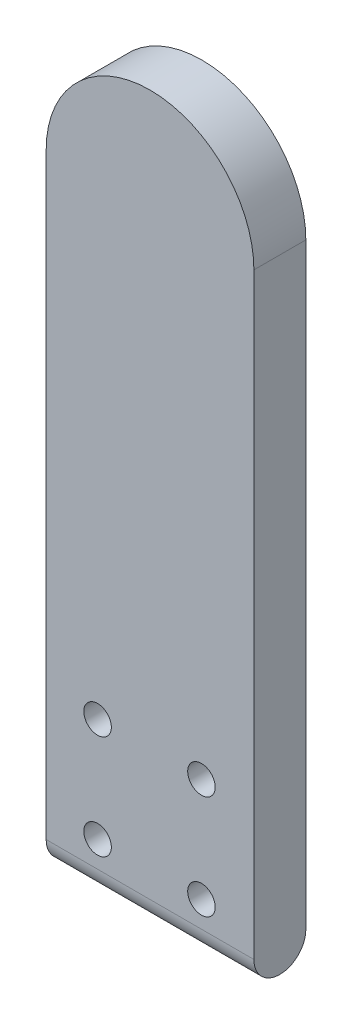
ISO-10303-21;
HEADER;
FILE_DESCRIPTION(('STEP AP214'),'2;1');
FILE_NAME('part.step','',(''),(''),'','','');
FILE_SCHEMA(('AUTOMOTIVE_DESIGN { 1 0 10303 214 1 1 1 1 }'));
ENDSEC;
DATA;
#1=APPLICATION_CONTEXT('core data for automotive mechanical design processes');
#2=APPLICATION_PROTOCOL_DEFINITION('international standard','automotive_design',2000,#1);
#3=PRODUCT_CONTEXT('',#1,'mechanical');
#4=PRODUCT('Part','Part','',(#3));
#5=PRODUCT_RELATED_PRODUCT_CATEGORY('part','',(#4));
#6=PRODUCT_DEFINITION_FORMATION('','',#4);
#7=PRODUCT_DEFINITION_CONTEXT('part definition',#1,'design');
#8=PRODUCT_DEFINITION('design','',#6,#7);
#9=PRODUCT_DEFINITION_SHAPE('','',#8);
#10=(LENGTH_UNIT() NAMED_UNIT(*) SI_UNIT(.MILLI.,.METRE.));
#11=(NAMED_UNIT(*) PLANE_ANGLE_UNIT() SI_UNIT($,.RADIAN.));
#12=(NAMED_UNIT(*) SI_UNIT($,.STERADIAN.) SOLID_ANGLE_UNIT());
#13=UNCERTAINTY_MEASURE_WITH_UNIT(LENGTH_MEASURE(1.E-05),#10,'distance_accuracy_value','');
#14=(GEOMETRIC_REPRESENTATION_CONTEXT(3) GLOBAL_UNCERTAINTY_ASSIGNED_CONTEXT((#13)) GLOBAL_UNIT_ASSIGNED_CONTEXT((#10,
#11,#12)) REPRESENTATION_CONTEXT('',''));
#15=CARTESIAN_POINT('',(0.,0.,0.));
#16=DIRECTION('',(0.,0.,1.));
#17=DIRECTION('',(1.,0.,0.));
#18=AXIS2_PLACEMENT_3D('',#15,#16,#17);
#19=CARTESIAN_POINT('',(-15.2585866419371,120.,6.19989115980894));
#20=DIRECTION('',(0.,0.,-1.));
#21=DIRECTION('',(-1.,0.,0.));
#22=AXIS2_PLACEMENT_3D('',#19,#20,#21);
#23=CYLINDRICAL_SURFACE('',#22,20.);
#24=DIRECTION('',(0.,0.,1.));
#25=VECTOR('',#24,1.);
#26=CARTESIAN_POINT('',(4.74141335806288,120.,6.19989115980894));
#27=LINE('',#26,#25);
#28=CARTESIAN_POINT('',(4.74141335806288,120.,6.19989115980894));
#29=VERTEX_POINT('',#28);
#30=CARTESIAN_POINT('',(4.74141335806288,120.,16.1998911598089));
#31=VERTEX_POINT('',#30);
#32=EDGE_CURVE('E105',#29,#31,#27,.T.);
#33=ORIENTED_EDGE('',*,*,#32,.F.);
#34=CARTESIAN_POINT('',(-15.2585866419371,120.,6.19989115980894));
#35=DIRECTION('',(0.,0.,1.));
#36=DIRECTION('',(1.,0.,0.));
#37=AXIS2_PLACEMENT_3D('',#34,#35,#36);
#38=CIRCLE('',#37,20.);
#39=CARTESIAN_POINT('',(-35.2585866419371,120.,6.19989115980894));
#40=VERTEX_POINT('',#39);
#41=EDGE_CURVE('E91',#40,#29,#38,.F.);
#42=ORIENTED_EDGE('',*,*,#41,.F.);
#43=DIRECTION('',(0.,0.,1.));
#44=VECTOR('',#43,1.);
#45=CARTESIAN_POINT('',(-35.2585866419371,120.,6.19989115980894));
#46=LINE('',#45,#44);
#47=CARTESIAN_POINT('',(-35.2585866419371,120.,16.1998911598089));
#48=VERTEX_POINT('',#47);
#49=EDGE_CURVE('E102',#48,#40,#46,.F.);
#50=ORIENTED_EDGE('',*,*,#49,.F.);
#51=CARTESIAN_POINT('',(-15.2585866419371,120.,16.1998911598089));
#52=DIRECTION('',(0.,0.,-1.));
#53=DIRECTION('',(-1.,0.,0.));
#54=AXIS2_PLACEMENT_3D('',#51,#52,#53);
#55=CIRCLE('',#54,20.);
#56=EDGE_CURVE('E101',#31,#48,#55,.F.);
#57=ORIENTED_EDGE('',*,*,#56,.F.);
#58=EDGE_LOOP('',(#33,#42,#50,#57));
#59=FACE_BOUND('',#58,.T.);
#60=ADVANCED_FACE('F45',(#59),#23,.T.);
#61=CARTESIAN_POINT('',(-35.2585866419371,140.,6.19989115980894));
#62=DIRECTION('',(1.,0.,0.));
#63=DIRECTION('',(0.,0.,-1.));
#64=AXIS2_PLACEMENT_3D('',#61,#62,#63);
#65=PLANE('',#64);
#66=CARTESIAN_POINT('',(-35.2585866419371,5.,11.1998911598089));
#67=DIRECTION('',(1.,0.,0.));
#68=DIRECTION('',(0.,0.,-1.));
#69=AXIS2_PLACEMENT_3D('',#66,#67,#68);
#70=CIRCLE('',#69,5.);
#71=CARTESIAN_POINT('',(-35.2585866419371,5.,6.19989115980894));
#72=VERTEX_POINT('',#71);
#73=CARTESIAN_POINT('',(-35.2585866419371,0.,11.1998911598089));
#74=VERTEX_POINT('',#73);
#75=EDGE_CURVE('E62',#72,#74,#70,.F.);
#76=ORIENTED_EDGE('',*,*,#75,.T.);
#77=CARTESIAN_POINT('',(-35.2585866419371,5.,11.1998911598089));
#78=DIRECTION('',(1.,0.,0.));
#79=DIRECTION('',(0.,0.,-1.));
#80=AXIS2_PLACEMENT_3D('',#77,#78,#79);
#81=CIRCLE('',#80,5.);
#82=CARTESIAN_POINT('',(-35.2585866419371,5.,16.1998911598089));
#83=VERTEX_POINT('',#82);
#84=EDGE_CURVE('E55',#74,#83,#81,.F.);
#85=ORIENTED_EDGE('',*,*,#84,.T.);
#86=DIRECTION('',(0.,-1.,0.));
#87=VECTOR('',#86,1.);
#88=CARTESIAN_POINT('',(-35.2585866419371,140.,16.1998911598089));
#89=LINE('',#88,#87);
#90=EDGE_CURVE('E110',#48,#83,#89,.T.);
#91=ORIENTED_EDGE('',*,*,#90,.F.);
#92=ORIENTED_EDGE('',*,*,#49,.T.);
#93=DIRECTION('',(0.,-1.,0.));
#94=VECTOR('',#93,1.);
#95=CARTESIAN_POINT('',(-35.2585866419371,140.,6.19989115980894));
#96=LINE('',#95,#94);
#97=EDGE_CURVE('E96',#40,#72,#96,.T.);
#98=ORIENTED_EDGE('',*,*,#97,.T.);
#99=EDGE_LOOP('',(#76,#85,#91,#92,#98));
#100=FACE_BOUND('',#99,.T.);
#101=ADVANCED_FACE('F146',(#100),#65,.F.);
#102=CARTESIAN_POINT('',(-35.2585866419371,140.,16.1998911598089));
#103=DIRECTION('',(0.,0.,-1.));
#104=DIRECTION('',(-1.,0.,0.));
#105=AXIS2_PLACEMENT_3D('',#102,#103,#104);
#106=PLANE('',#105);
#107=CARTESIAN_POINT('',(-5.35858664193712,30.,16.1998911598089));
#108=DIRECTION('',(0.,0.,-1.));
#109=DIRECTION('',(-1.,0.,0.));
#110=AXIS2_PLACEMENT_3D('',#107,#108,#109);
#111=CIRCLE('',#110,2.65);
#112=CARTESIAN_POINT('',(-8.00858664193711,30.,16.1998911598089));
#113=VERTEX_POINT('',#112);
#114=EDGE_CURVE('E155',#113,#113,#111,.T.);
#115=ORIENTED_EDGE('',*,*,#114,.T.);
#116=EDGE_LOOP('',(#115));
#117=FACE_BOUND('',#116,.T.);
#118=CARTESIAN_POINT('',(-25.3585866419371,30.,16.1998911598089));
#119=DIRECTION('',(0.,0.,-1.));
#120=DIRECTION('',(-1.,0.,0.));
#121=AXIS2_PLACEMENT_3D('',#118,#119,#120);
#122=CIRCLE('',#121,2.65);
#123=CARTESIAN_POINT('',(-28.0085866419371,30.,16.1998911598089));
#124=VERTEX_POINT('',#123);
#125=EDGE_CURVE('E164',#124,#124,#122,.T.);
#126=ORIENTED_EDGE('',*,*,#125,.T.);
#127=EDGE_LOOP('',(#126));
#128=FACE_BOUND('',#127,.T.);
#129=CARTESIAN_POINT('',(-25.3585866419371,10.,16.1998911598089));
#130=DIRECTION('',(0.,0.,-1.));
#131=DIRECTION('',(-1.,0.,0.));
#132=AXIS2_PLACEMENT_3D('',#129,#130,#131);
#133=CIRCLE('',#132,2.65);
#134=CARTESIAN_POINT('',(-28.0085866419371,10.,16.1998911598089));
#135=VERTEX_POINT('',#134);
#136=EDGE_CURVE('E178',#135,#135,#133,.T.);
#137=ORIENTED_EDGE('',*,*,#136,.T.);
#138=EDGE_LOOP('',(#137));
#139=FACE_BOUND('',#138,.T.);
#140=CARTESIAN_POINT('',(-5.35858664193711,10.,16.1998911598089));
#141=DIRECTION('',(0.,0.,-1.));
#142=DIRECTION('',(-1.,0.,0.));
#143=AXIS2_PLACEMENT_3D('',#140,#141,#142);
#144=CIRCLE('',#143,2.65);
#145=CARTESIAN_POINT('',(-8.00858664193711,10.,16.1998911598089));
#146=VERTEX_POINT('',#145);
#147=EDGE_CURVE('E121',#146,#146,#144,.T.);
#148=ORIENTED_EDGE('',*,*,#147,.T.);
#149=EDGE_LOOP('',(#148));
#150=FACE_BOUND('',#149,.T.);
#151=ORIENTED_EDGE('',*,*,#90,.T.);
#152=DIRECTION('',(1.,0.,0.));
#153=VECTOR('',#152,1.);
#154=CARTESIAN_POINT('',(-35.2585866419371,5.,16.1998911598089));
#155=LINE('',#154,#153);
#156=CARTESIAN_POINT('',(4.74141335806288,5.,16.1998911598089));
#157=VERTEX_POINT('',#156);
#158=EDGE_CURVE('E132',#83,#157,#155,.T.);
#159=ORIENTED_EDGE('',*,*,#158,.T.);
#160=DIRECTION('',(0.,-1.,0.));
#161=VECTOR('',#160,1.);
#162=CARTESIAN_POINT('',(4.74141335806288,140.,16.1998911598089));
#163=LINE('',#162,#161);
#164=EDGE_CURVE('E116',#31,#157,#163,.T.);
#165=ORIENTED_EDGE('',*,*,#164,.F.);
#166=ORIENTED_EDGE('',*,*,#56,.T.);
#167=EDGE_LOOP('',(#151,#159,#165,#166));
#168=FACE_BOUND('',#167,.T.);
#169=ADVANCED_FACE('F151',(#117,#128,#139,#150,#168),#106,.F.);
#170=CARTESIAN_POINT('',(4.74141335806288,140.,6.19989115980894));
#171=DIRECTION('',(-1.,0.,0.));
#172=DIRECTION('',(0.,0.,1.));
#173=AXIS2_PLACEMENT_3D('',#170,#171,#172);
#174=PLANE('',#173);
#175=ORIENTED_EDGE('',*,*,#164,.T.);
#176=CARTESIAN_POINT('',(4.74141335806288,5.,11.1998911598089));
#177=DIRECTION('',(-1.,0.,0.));
#178=DIRECTION('',(0.,0.,1.));
#179=AXIS2_PLACEMENT_3D('',#176,#177,#178);
#180=CIRCLE('',#179,5.);
#181=CARTESIAN_POINT('',(4.74141335806288,0.,11.1998911598089));
#182=VERTEX_POINT('',#181);
#183=EDGE_CURVE('E138',#157,#182,#180,.F.);
#184=ORIENTED_EDGE('',*,*,#183,.T.);
#185=CARTESIAN_POINT('',(4.74141335806288,5.,11.1998911598089));
#186=DIRECTION('',(-1.,0.,0.));
#187=DIRECTION('',(0.,0.,1.));
#188=AXIS2_PLACEMENT_3D('',#185,#186,#187);
#189=CIRCLE('',#188,5.);
#190=CARTESIAN_POINT('',(4.74141335806288,5.,6.19989115980894));
#191=VERTEX_POINT('',#190);
#192=EDGE_CURVE('E114',#182,#191,#189,.F.);
#193=ORIENTED_EDGE('',*,*,#192,.T.);
#194=DIRECTION('',(0.,-1.,0.));
#195=VECTOR('',#194,1.);
#196=CARTESIAN_POINT('',(4.74141335806288,140.,6.19989115980894));
#197=LINE('',#196,#195);
#198=EDGE_CURVE('E95',#29,#191,#197,.T.);
#199=ORIENTED_EDGE('',*,*,#198,.F.);
#200=ORIENTED_EDGE('',*,*,#32,.T.);
#201=EDGE_LOOP('',(#175,#184,#193,#199,#200));
#202=FACE_BOUND('',#201,.T.);
#203=ADVANCED_FACE('F112',(#202),#174,.F.);
#204=CARTESIAN_POINT('',(-35.2585866419371,140.,6.19989115980894));
#205=DIRECTION('',(0.,0.,1.));
#206=DIRECTION('',(1.,0.,0.));
#207=AXIS2_PLACEMENT_3D('',#204,#205,#206);
#208=PLANE('',#207);
#209=CARTESIAN_POINT('',(-5.35858664193712,30.,6.19989115980894));
#210=DIRECTION('',(0.,0.,-1.));
#211=DIRECTION('',(-1.,0.,0.));
#212=AXIS2_PLACEMENT_3D('',#209,#210,#211);
#213=CIRCLE('',#212,2.65);
#214=CARTESIAN_POINT('',(-8.00858664193711,30.,6.19989115980894));
#215=VERTEX_POINT('',#214);
#216=EDGE_CURVE('E158',#215,#215,#213,.T.);
#217=ORIENTED_EDGE('',*,*,#216,.F.);
#218=EDGE_LOOP('',(#217));
#219=FACE_BOUND('',#218,.T.);
#220=CARTESIAN_POINT('',(-25.3585866419371,30.,6.19989115980894));
#221=DIRECTION('',(0.,0.,-1.));
#222=DIRECTION('',(-1.,0.,0.));
#223=AXIS2_PLACEMENT_3D('',#220,#221,#222);
#224=CIRCLE('',#223,2.65);
#225=CARTESIAN_POINT('',(-28.0085866419371,30.,6.19989115980894));
#226=VERTEX_POINT('',#225);
#227=EDGE_CURVE('E184',#226,#226,#224,.T.);
#228=ORIENTED_EDGE('',*,*,#227,.F.);
#229=EDGE_LOOP('',(#228));
#230=FACE_BOUND('',#229,.T.);
#231=CARTESIAN_POINT('',(-25.3585866419371,10.,6.19989115980894));
#232=DIRECTION('',(0.,0.,-1.));
#233=DIRECTION('',(-1.,0.,0.));
#234=AXIS2_PLACEMENT_3D('',#231,#232,#233);
#235=CIRCLE('',#234,2.65);
#236=CARTESIAN_POINT('',(-28.0085866419371,10.,6.19989115980894));
#237=VERTEX_POINT('',#236);
#238=EDGE_CURVE('E173',#237,#237,#235,.T.);
#239=ORIENTED_EDGE('',*,*,#238,.F.);
#240=EDGE_LOOP('',(#239));
#241=FACE_BOUND('',#240,.T.);
#242=CARTESIAN_POINT('',(-5.35858664193711,10.,6.19989115980894));
#243=DIRECTION('',(0.,0.,-1.));
#244=DIRECTION('',(-1.,0.,0.));
#245=AXIS2_PLACEMENT_3D('',#242,#243,#244);
#246=CIRCLE('',#245,2.65);
#247=CARTESIAN_POINT('',(-8.00858664193711,10.,6.19989115980894));
#248=VERTEX_POINT('',#247);
#249=EDGE_CURVE('E170',#248,#248,#246,.T.);
#250=ORIENTED_EDGE('',*,*,#249,.F.);
#251=EDGE_LOOP('',(#250));
#252=FACE_BOUND('',#251,.T.);
#253=ORIENTED_EDGE('',*,*,#198,.T.);
#254=DIRECTION('',(-1.,0.,0.));
#255=VECTOR('',#254,1.);
#256=CARTESIAN_POINT('',(-35.2585866419371,5.,6.19989115980894));
#257=LINE('',#256,#255);
#258=EDGE_CURVE('E11',#191,#72,#257,.T.);
#259=ORIENTED_EDGE('',*,*,#258,.T.);
#260=ORIENTED_EDGE('',*,*,#97,.F.);
#261=ORIENTED_EDGE('',*,*,#41,.T.);
#262=EDGE_LOOP('',(#253,#259,#260,#261));
#263=FACE_BOUND('',#262,.T.);
#264=ADVANCED_FACE('F93',(#219,#230,#241,#252,#263),#208,.F.);
#265=CARTESIAN_POINT('',(-5.35858664193711,10.,16.1998911598089));
#266=DIRECTION('',(0.,0.,-1.));
#267=DIRECTION('',(-1.,0.,0.));
#268=AXIS2_PLACEMENT_3D('',#265,#266,#267);
#269=CYLINDRICAL_SURFACE('',#268,2.65);
#270=ORIENTED_EDGE('',*,*,#147,.F.);
#271=EDGE_LOOP('',(#270));
#272=FACE_BOUND('',#271,.T.);
#273=ORIENTED_EDGE('',*,*,#249,.T.);
#274=EDGE_LOOP('',(#273));
#275=FACE_BOUND('',#274,.T.);
#276=ADVANCED_FACE('F205',(#272,#275),#269,.F.);
#277=CARTESIAN_POINT('',(-25.3585866419371,10.,16.1998911598089));
#278=DIRECTION('',(0.,0.,-1.));
#279=DIRECTION('',(-1.,0.,0.));
#280=AXIS2_PLACEMENT_3D('',#277,#278,#279);
#281=CYLINDRICAL_SURFACE('',#280,2.65);
#282=ORIENTED_EDGE('',*,*,#136,.F.);
#283=EDGE_LOOP('',(#282));
#284=FACE_BOUND('',#283,.T.);
#285=ORIENTED_EDGE('',*,*,#238,.T.);
#286=EDGE_LOOP('',(#285));
#287=FACE_BOUND('',#286,.T.);
#288=ADVANCED_FACE('F199',(#284,#287),#281,.F.);
#289=CARTESIAN_POINT('',(-25.3585866419371,30.,16.1998911598089));
#290=DIRECTION('',(0.,0.,-1.));
#291=DIRECTION('',(-1.,0.,0.));
#292=AXIS2_PLACEMENT_3D('',#289,#290,#291);
#293=CYLINDRICAL_SURFACE('',#292,2.65);
#294=ORIENTED_EDGE('',*,*,#125,.F.);
#295=EDGE_LOOP('',(#294));
#296=FACE_BOUND('',#295,.T.);
#297=ORIENTED_EDGE('',*,*,#227,.T.);
#298=EDGE_LOOP('',(#297));
#299=FACE_BOUND('',#298,.T.);
#300=ADVANCED_FACE('F195',(#296,#299),#293,.F.);
#301=CARTESIAN_POINT('',(-5.35858664193712,30.,16.1998911598089));
#302=DIRECTION('',(0.,0.,-1.));
#303=DIRECTION('',(-1.,0.,0.));
#304=AXIS2_PLACEMENT_3D('',#301,#302,#303);
#305=CYLINDRICAL_SURFACE('',#304,2.65);
#306=ORIENTED_EDGE('',*,*,#114,.F.);
#307=EDGE_LOOP('',(#306));
#308=FACE_BOUND('',#307,.T.);
#309=ORIENTED_EDGE('',*,*,#216,.T.);
#310=EDGE_LOOP('',(#309));
#311=FACE_BOUND('',#310,.T.);
#312=ADVANCED_FACE('F198',(#308,#311),#305,.F.);
#313=CARTESIAN_POINT('',(-35.2585866419371,5.,11.1998911598089));
#314=DIRECTION('',(-1.,0.,0.));
#315=DIRECTION('',(0.,0.,1.));
#316=AXIS2_PLACEMENT_3D('',#313,#314,#315);
#317=CYLINDRICAL_SURFACE('',#316,5.);
#318=DIRECTION('',(-1.,0.,0.));
#319=VECTOR('',#318,1.);
#320=CARTESIAN_POINT('',(0.,0.,11.1998911598089));
#321=LINE('',#320,#319);
#322=EDGE_CURVE('E49',#74,#182,#321,.F.);
#323=ORIENTED_EDGE('',*,*,#322,.F.);
#324=ORIENTED_EDGE('',*,*,#75,.F.);
#325=ORIENTED_EDGE('',*,*,#258,.F.);
#326=ORIENTED_EDGE('',*,*,#192,.F.);
#327=EDGE_LOOP('',(#323,#324,#325,#326));
#328=FACE_BOUND('',#327,.T.);
#329=ADVANCED_FACE('F47',(#328),#317,.T.);
#330=CARTESIAN_POINT('',(-35.2585866419371,5.,11.1998911598089));
#331=DIRECTION('',(1.,0.,0.));
#332=DIRECTION('',(0.,0.,-1.));
#333=AXIS2_PLACEMENT_3D('',#330,#331,#332);
#334=CYLINDRICAL_SURFACE('',#333,5.);
#335=ORIENTED_EDGE('',*,*,#84,.F.);
#336=ORIENTED_EDGE('',*,*,#322,.T.);
#337=ORIENTED_EDGE('',*,*,#183,.F.);
#338=ORIENTED_EDGE('',*,*,#158,.F.);
#339=EDGE_LOOP('',(#335,#336,#337,#338));
#340=FACE_BOUND('',#339,.T.);
#341=ADVANCED_FACE('F152',(#340),#334,.T.);
#342=CLOSED_SHELL('',(#60,#101,#169,#203,#264,#276,#288,#300,#312,#329,#341));
#343=MANIFOLD_SOLID_BREP('B2',#342);
#344=ADVANCED_BREP_SHAPE_REPRESENTATION('',(#18,#343),#14);
#345=SHAPE_DEFINITION_REPRESENTATION(#9,#344);
ENDSEC;
END-ISO-10303-21;
